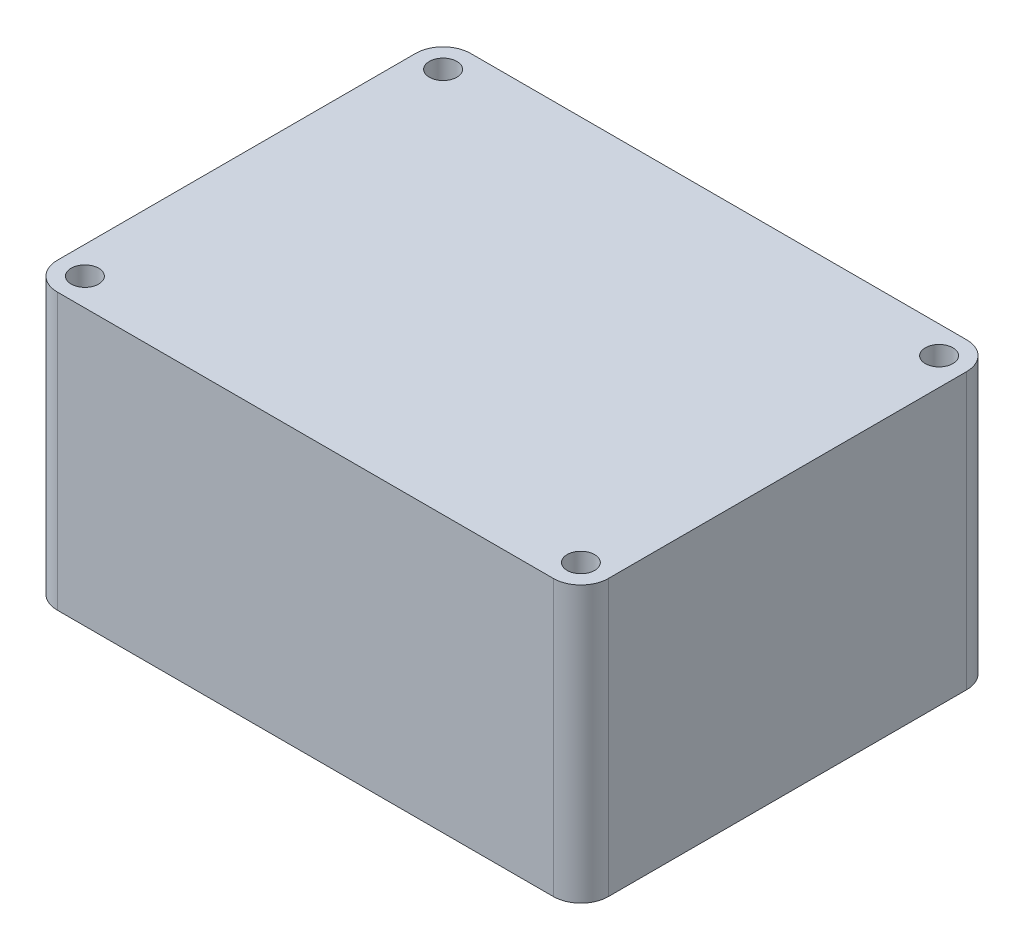
ISO-10303-21;
HEADER;
FILE_DESCRIPTION(('STEP AP214'),'2;1');
FILE_NAME('part.step','',(''),(''),'','','');
FILE_SCHEMA(('AUTOMOTIVE_DESIGN { 1 0 10303 214 1 1 1 1 }'));
ENDSEC;
DATA;
#1=APPLICATION_CONTEXT('core data for automotive mechanical design processes');
#2=APPLICATION_PROTOCOL_DEFINITION('international standard','automotive_design',2000,#1);
#3=PRODUCT_CONTEXT('',#1,'mechanical');
#4=PRODUCT('Part','Part','',(#3));
#5=PRODUCT_RELATED_PRODUCT_CATEGORY('part','',(#4));
#6=PRODUCT_DEFINITION_FORMATION('','',#4);
#7=PRODUCT_DEFINITION_CONTEXT('part definition',#1,'design');
#8=PRODUCT_DEFINITION('design','',#6,#7);
#9=PRODUCT_DEFINITION_SHAPE('','',#8);
#10=(LENGTH_UNIT() NAMED_UNIT(*) SI_UNIT(.MILLI.,.METRE.));
#11=(NAMED_UNIT(*) PLANE_ANGLE_UNIT() SI_UNIT($,.RADIAN.));
#12=(NAMED_UNIT(*) SI_UNIT($,.STERADIAN.) SOLID_ANGLE_UNIT());
#13=UNCERTAINTY_MEASURE_WITH_UNIT(LENGTH_MEASURE(1.E-05),#10,'distance_accuracy_value','');
#14=(GEOMETRIC_REPRESENTATION_CONTEXT(3) GLOBAL_UNCERTAINTY_ASSIGNED_CONTEXT((#13)) GLOBAL_UNIT_ASSIGNED_CONTEXT((#10,
#11,#12)) REPRESENTATION_CONTEXT('',''));
#15=CARTESIAN_POINT('',(0.,0.,0.));
#16=DIRECTION('',(0.,0.,1.));
#17=DIRECTION('',(1.,0.,0.));
#18=AXIS2_PLACEMENT_3D('',#15,#16,#17);
#19=CARTESIAN_POINT('',(-100.,100.,-75.));
#20=DIRECTION('',(1.,0.,0.));
#21=DIRECTION('',(0.,0.,-1.));
#22=AXIS2_PLACEMENT_3D('',#19,#20,#21);
#23=PLANE('',#22);
#24=DIRECTION('',(0.,0.,1.));
#25=VECTOR('',#24,1.);
#26=CARTESIAN_POINT('',(-100.,100.,-75.));
#27=LINE('',#26,#25);
#28=CARTESIAN_POINT('',(-100.,100.,-65.));
#29=VERTEX_POINT('',#28);
#30=CARTESIAN_POINT('',(-100.,100.,65.));
#31=VERTEX_POINT('',#30);
#32=EDGE_CURVE('E124',#29,#31,#27,.T.);
#33=ORIENTED_EDGE('',*,*,#32,.F.);
#34=DIRECTION('',(0.,-1.,0.));
#35=VECTOR('',#34,1.);
#36=CARTESIAN_POINT('',(-100.,100.,-65.));
#37=LINE('',#36,#35);
#38=CARTESIAN_POINT('',(-100.,0.,-65.));
#39=VERTEX_POINT('',#38);
#40=EDGE_CURVE('E109',#29,#39,#37,.T.);
#41=ORIENTED_EDGE('',*,*,#40,.T.);
#42=DIRECTION('',(0.,0.,1.));
#43=VECTOR('',#42,1.);
#44=CARTESIAN_POINT('',(-100.,0.,-75.));
#45=LINE('',#44,#43);
#46=CARTESIAN_POINT('',(-100.,0.,65.));
#47=VERTEX_POINT('',#46);
#48=EDGE_CURVE('E121',#39,#47,#45,.T.);
#49=ORIENTED_EDGE('',*,*,#48,.T.);
#50=DIRECTION('',(0.,-1.,0.));
#51=VECTOR('',#50,1.);
#52=CARTESIAN_POINT('',(-100.,100.,65.));
#53=LINE('',#52,#51);
#54=EDGE_CURVE('E126',#47,#31,#53,.F.);
#55=ORIENTED_EDGE('',*,*,#54,.T.);
#56=EDGE_LOOP('',(#33,#41,#49,#55));
#57=FACE_BOUND('',#56,.T.);
#58=ADVANCED_FACE('F39',(#57),#23,.F.);
#59=CARTESIAN_POINT('',(-100.,100.,75.));
#60=DIRECTION('',(0.,0.,-1.));
#61=DIRECTION('',(-1.,0.,0.));
#62=AXIS2_PLACEMENT_3D('',#59,#60,#61);
#63=PLANE('',#62);
#64=DIRECTION('',(1.,0.,0.));
#65=VECTOR('',#64,1.);
#66=CARTESIAN_POINT('',(-100.,0.,75.));
#67=LINE('',#66,#65);
#68=CARTESIAN_POINT('',(-90.,0.,75.));
#69=VERTEX_POINT('',#68);
#70=CARTESIAN_POINT('',(90.,0.,75.));
#71=VERTEX_POINT('',#70);
#72=EDGE_CURVE('E130',#69,#71,#67,.T.);
#73=ORIENTED_EDGE('',*,*,#72,.T.);
#74=DIRECTION('',(0.,-1.,0.));
#75=VECTOR('',#74,1.);
#76=CARTESIAN_POINT('',(90.,100.,75.));
#77=LINE('',#76,#75);
#78=CARTESIAN_POINT('',(90.,100.,75.));
#79=VERTEX_POINT('',#78);
#80=EDGE_CURVE('E11',#71,#79,#77,.F.);
#81=ORIENTED_EDGE('',*,*,#80,.T.);
#82=DIRECTION('',(1.,0.,0.));
#83=VECTOR('',#82,1.);
#84=CARTESIAN_POINT('',(-100.,100.,75.));
#85=LINE('',#84,#83);
#86=CARTESIAN_POINT('',(-90.,100.,75.));
#87=VERTEX_POINT('',#86);
#88=EDGE_CURVE('E170',#87,#79,#85,.T.);
#89=ORIENTED_EDGE('',*,*,#88,.F.);
#90=DIRECTION('',(0.,-1.,0.));
#91=VECTOR('',#90,1.);
#92=CARTESIAN_POINT('',(-90.,100.,75.));
#93=LINE('',#92,#91);
#94=EDGE_CURVE('E47',#87,#69,#93,.T.);
#95=ORIENTED_EDGE('',*,*,#94,.T.);
#96=EDGE_LOOP('',(#73,#81,#89,#95));
#97=FACE_BOUND('',#96,.T.);
#98=ADVANCED_FACE('F168',(#97),#63,.F.);
#99=CARTESIAN_POINT('',(100.,100.,-75.));
#100=DIRECTION('',(-1.,0.,0.));
#101=DIRECTION('',(0.,0.,1.));
#102=AXIS2_PLACEMENT_3D('',#99,#100,#101);
#103=PLANE('',#102);
#104=DIRECTION('',(0.,0.,-1.));
#105=VECTOR('',#104,1.);
#106=CARTESIAN_POINT('',(100.,0.,-75.));
#107=LINE('',#106,#105);
#108=CARTESIAN_POINT('',(100.,0.,65.));
#109=VERTEX_POINT('',#108);
#110=CARTESIAN_POINT('',(100.,0.,-65.));
#111=VERTEX_POINT('',#110);
#112=EDGE_CURVE('E134',#109,#111,#107,.T.);
#113=ORIENTED_EDGE('',*,*,#112,.T.);
#114=DIRECTION('',(0.,-1.,0.));
#115=VECTOR('',#114,1.);
#116=CARTESIAN_POINT('',(100.,100.,-65.));
#117=LINE('',#116,#115);
#118=CARTESIAN_POINT('',(100.,100.,-65.));
#119=VERTEX_POINT('',#118);
#120=EDGE_CURVE('E54',#111,#119,#117,.F.);
#121=ORIENTED_EDGE('',*,*,#120,.T.);
#122=DIRECTION('',(0.,0.,-1.));
#123=VECTOR('',#122,1.);
#124=CARTESIAN_POINT('',(100.,100.,-75.));
#125=LINE('',#124,#123);
#126=CARTESIAN_POINT('',(100.,100.,65.));
#127=VERTEX_POINT('',#126);
#128=EDGE_CURVE('E178',#127,#119,#125,.T.);
#129=ORIENTED_EDGE('',*,*,#128,.F.);
#130=DIRECTION('',(0.,-1.,0.));
#131=VECTOR('',#130,1.);
#132=CARTESIAN_POINT('',(100.,100.,65.));
#133=LINE('',#132,#131);
#134=EDGE_CURVE('E161',#127,#109,#133,.T.);
#135=ORIENTED_EDGE('',*,*,#134,.T.);
#136=EDGE_LOOP('',(#113,#121,#129,#135));
#137=FACE_BOUND('',#136,.T.);
#138=ADVANCED_FACE('F177',(#137),#103,.F.);
#139=CARTESIAN_POINT('',(-100.,100.,-75.));
#140=DIRECTION('',(0.,0.,1.));
#141=DIRECTION('',(1.,0.,0.));
#142=AXIS2_PLACEMENT_3D('',#139,#140,#141);
#143=PLANE('',#142);
#144=DIRECTION('',(-1.,0.,0.));
#145=VECTOR('',#144,1.);
#146=CARTESIAN_POINT('',(-100.,0.,-75.));
#147=LINE('',#146,#145);
#148=CARTESIAN_POINT('',(90.,0.,-75.));
#149=VERTEX_POINT('',#148);
#150=CARTESIAN_POINT('',(-90.,0.,-75.));
#151=VERTEX_POINT('',#150);
#152=EDGE_CURVE('E144',#149,#151,#147,.T.);
#153=ORIENTED_EDGE('',*,*,#152,.T.);
#154=DIRECTION('',(0.,-1.,0.));
#155=VECTOR('',#154,1.);
#156=CARTESIAN_POINT('',(-90.,100.,-75.));
#157=LINE('',#156,#155);
#158=CARTESIAN_POINT('',(-90.,100.,-75.));
#159=VERTEX_POINT('',#158);
#160=EDGE_CURVE('E110',#151,#159,#157,.F.);
#161=ORIENTED_EDGE('',*,*,#160,.T.);
#162=DIRECTION('',(-1.,0.,0.));
#163=VECTOR('',#162,1.);
#164=CARTESIAN_POINT('',(-100.,100.,-75.));
#165=LINE('',#164,#163);
#166=CARTESIAN_POINT('',(90.,100.,-75.));
#167=VERTEX_POINT('',#166);
#168=EDGE_CURVE('E140',#167,#159,#165,.T.);
#169=ORIENTED_EDGE('',*,*,#168,.F.);
#170=DIRECTION('',(0.,-1.,0.));
#171=VECTOR('',#170,1.);
#172=CARTESIAN_POINT('',(90.,100.,-75.));
#173=LINE('',#172,#171);
#174=EDGE_CURVE('E115',#167,#149,#173,.T.);
#175=ORIENTED_EDGE('',*,*,#174,.T.);
#176=EDGE_LOOP('',(#153,#161,#169,#175));
#177=FACE_BOUND('',#176,.T.);
#178=ADVANCED_FACE('F217',(#177),#143,.F.);
#179=CARTESIAN_POINT('',(0.,100.,0.));
#180=DIRECTION('',(0.,1.,0.));
#181=DIRECTION('',(0.,0.,1.));
#182=AXIS2_PLACEMENT_3D('',#179,#180,#181);
#183=PLANE('',#182);
#184=CARTESIAN_POINT('',(90.,100.,65.));
#185=DIRECTION('',(0.,1.,0.));
#186=DIRECTION('',(0.,0.,-1.));
#187=AXIS2_PLACEMENT_3D('',#184,#185,#186);
#188=CIRCLE('',#187,4.99999999999999);
#189=CARTESIAN_POINT('',(90.,100.,60.));
#190=VERTEX_POINT('',#189);
#191=EDGE_CURVE('E199',#190,#190,#188,.T.);
#192=ORIENTED_EDGE('',*,*,#191,.F.);
#193=EDGE_LOOP('',(#192));
#194=FACE_BOUND('',#193,.T.);
#195=CARTESIAN_POINT('',(-90.,100.,65.));
#196=DIRECTION('',(0.,-1.,0.));
#197=DIRECTION('',(0.,0.,-1.));
#198=AXIS2_PLACEMENT_3D('',#195,#196,#197);
#199=CIRCLE('',#198,4.99999999999999);
#200=CARTESIAN_POINT('',(-90.,100.,60.));
#201=VERTEX_POINT('',#200);
#202=EDGE_CURVE('E193',#201,#201,#199,.T.);
#203=ORIENTED_EDGE('',*,*,#202,.T.);
#204=EDGE_LOOP('',(#203));
#205=FACE_BOUND('',#204,.T.);
#206=CARTESIAN_POINT('',(90.,100.,-65.));
#207=DIRECTION('',(0.,-1.,0.));
#208=DIRECTION('',(0.,0.,1.));
#209=AXIS2_PLACEMENT_3D('',#206,#207,#208);
#210=CIRCLE('',#209,4.99999999999999);
#211=CARTESIAN_POINT('',(90.,100.,-60.));
#212=VERTEX_POINT('',#211);
#213=EDGE_CURVE('E187',#212,#212,#210,.T.);
#214=ORIENTED_EDGE('',*,*,#213,.T.);
#215=EDGE_LOOP('',(#214));
#216=FACE_BOUND('',#215,.T.);
#217=CARTESIAN_POINT('',(-90.,100.,-65.));
#218=DIRECTION('',(0.,1.,0.));
#219=DIRECTION('',(0.,0.,1.));
#220=AXIS2_PLACEMENT_3D('',#217,#218,#219);
#221=CIRCLE('',#220,4.99999999999999);
#222=CARTESIAN_POINT('',(-90.,100.,-60.));
#223=VERTEX_POINT('',#222);
#224=EDGE_CURVE('E137',#223,#223,#221,.T.);
#225=ORIENTED_EDGE('',*,*,#224,.F.);
#226=EDGE_LOOP('',(#225));
#227=FACE_BOUND('',#226,.T.);
#228=ORIENTED_EDGE('',*,*,#168,.T.);
#229=CARTESIAN_POINT('',(-90.,100.,-65.));
#230=DIRECTION('',(0.,1.,0.));
#231=DIRECTION('',(0.,0.,1.));
#232=AXIS2_PLACEMENT_3D('',#229,#230,#231);
#233=CIRCLE('',#232,10.);
#234=EDGE_CURVE('E159',#159,#29,#233,.T.);
#235=ORIENTED_EDGE('',*,*,#234,.T.);
#236=ORIENTED_EDGE('',*,*,#32,.T.);
#237=CARTESIAN_POINT('',(-90.,100.,65.));
#238=DIRECTION('',(0.,1.,0.));
#239=DIRECTION('',(0.,0.,1.));
#240=AXIS2_PLACEMENT_3D('',#237,#238,#239);
#241=CIRCLE('',#240,10.);
#242=EDGE_CURVE('E154',#31,#87,#241,.T.);
#243=ORIENTED_EDGE('',*,*,#242,.T.);
#244=ORIENTED_EDGE('',*,*,#88,.T.);
#245=CARTESIAN_POINT('',(90.,100.,65.));
#246=DIRECTION('',(0.,1.,0.));
#247=DIRECTION('',(0.,0.,1.));
#248=AXIS2_PLACEMENT_3D('',#245,#246,#247);
#249=CIRCLE('',#248,10.);
#250=EDGE_CURVE('E61',#79,#127,#249,.T.);
#251=ORIENTED_EDGE('',*,*,#250,.T.);
#252=ORIENTED_EDGE('',*,*,#128,.T.);
#253=CARTESIAN_POINT('',(90.,100.,-65.));
#254=DIRECTION('',(0.,1.,0.));
#255=DIRECTION('',(0.,0.,1.));
#256=AXIS2_PLACEMENT_3D('',#253,#254,#255);
#257=CIRCLE('',#256,10.);
#258=EDGE_CURVE('E157',#119,#167,#257,.T.);
#259=ORIENTED_EDGE('',*,*,#258,.T.);
#260=EDGE_LOOP('',(#228,#235,#236,#243,#244,#251,#252,#259));
#261=FACE_BOUND('',#260,.T.);
#262=ADVANCED_FACE('F214',(#194,#205,#216,#227,#261),#183,.T.);
#263=CARTESIAN_POINT('',(0.,0.,0.));
#264=DIRECTION('',(0.,1.,0.));
#265=DIRECTION('',(0.,0.,1.));
#266=AXIS2_PLACEMENT_3D('',#263,#264,#265);
#267=PLANE('',#266);
#268=CARTESIAN_POINT('',(90.,0.,65.));
#269=DIRECTION('',(0.,1.,0.));
#270=DIRECTION('',(0.,0.,-1.));
#271=AXIS2_PLACEMENT_3D('',#268,#269,#270);
#272=CIRCLE('',#271,4.99999999999999);
#273=CARTESIAN_POINT('',(90.,0.,60.));
#274=VERTEX_POINT('',#273);
#275=EDGE_CURVE('E196',#274,#274,#272,.T.);
#276=ORIENTED_EDGE('',*,*,#275,.T.);
#277=EDGE_LOOP('',(#276));
#278=FACE_BOUND('',#277,.T.);
#279=CARTESIAN_POINT('',(-90.,0.,65.));
#280=DIRECTION('',(0.,-1.,0.));
#281=DIRECTION('',(0.,0.,-1.));
#282=AXIS2_PLACEMENT_3D('',#279,#280,#281);
#283=CIRCLE('',#282,4.99999999999999);
#284=CARTESIAN_POINT('',(-90.,0.,60.));
#285=VERTEX_POINT('',#284);
#286=EDGE_CURVE('E190',#285,#285,#283,.T.);
#287=ORIENTED_EDGE('',*,*,#286,.F.);
#288=EDGE_LOOP('',(#287));
#289=FACE_BOUND('',#288,.T.);
#290=CARTESIAN_POINT('',(90.,0.,-65.));
#291=DIRECTION('',(0.,-1.,0.));
#292=DIRECTION('',(0.,0.,1.));
#293=AXIS2_PLACEMENT_3D('',#290,#291,#292);
#294=CIRCLE('',#293,4.99999999999999);
#295=CARTESIAN_POINT('',(90.,0.,-60.));
#296=VERTEX_POINT('',#295);
#297=EDGE_CURVE('E185',#296,#296,#294,.T.);
#298=ORIENTED_EDGE('',*,*,#297,.F.);
#299=EDGE_LOOP('',(#298));
#300=FACE_BOUND('',#299,.T.);
#301=CARTESIAN_POINT('',(-90.,0.,-65.));
#302=DIRECTION('',(0.,1.,0.));
#303=DIRECTION('',(0.,0.,1.));
#304=AXIS2_PLACEMENT_3D('',#301,#302,#303);
#305=CIRCLE('',#304,4.99999999999999);
#306=CARTESIAN_POINT('',(-90.,0.,-60.));
#307=VERTEX_POINT('',#306);
#308=EDGE_CURVE('E131',#307,#307,#305,.T.);
#309=ORIENTED_EDGE('',*,*,#308,.T.);
#310=EDGE_LOOP('',(#309));
#311=FACE_BOUND('',#310,.T.);
#312=ORIENTED_EDGE('',*,*,#48,.F.);
#313=CARTESIAN_POINT('',(-90.,0.,-65.));
#314=DIRECTION('',(0.,1.,0.));
#315=DIRECTION('',(0.,0.,1.));
#316=AXIS2_PLACEMENT_3D('',#313,#314,#315);
#317=CIRCLE('',#316,10.);
#318=EDGE_CURVE('E105',#39,#151,#317,.F.);
#319=ORIENTED_EDGE('',*,*,#318,.T.);
#320=ORIENTED_EDGE('',*,*,#152,.F.);
#321=CARTESIAN_POINT('',(90.,0.,-65.));
#322=DIRECTION('',(0.,1.,0.));
#323=DIRECTION('',(0.,0.,1.));
#324=AXIS2_PLACEMENT_3D('',#321,#322,#323);
#325=CIRCLE('',#324,10.);
#326=EDGE_CURVE('E116',#149,#111,#325,.F.);
#327=ORIENTED_EDGE('',*,*,#326,.T.);
#328=ORIENTED_EDGE('',*,*,#112,.F.);
#329=CARTESIAN_POINT('',(90.,0.,65.));
#330=DIRECTION('',(0.,1.,0.));
#331=DIRECTION('',(0.,0.,1.));
#332=AXIS2_PLACEMENT_3D('',#329,#330,#331);
#333=CIRCLE('',#332,10.);
#334=EDGE_CURVE('E148',#109,#71,#333,.F.);
#335=ORIENTED_EDGE('',*,*,#334,.T.);
#336=ORIENTED_EDGE('',*,*,#72,.F.);
#337=CARTESIAN_POINT('',(-90.,0.,65.));
#338=DIRECTION('',(0.,1.,0.));
#339=DIRECTION('',(0.,0.,1.));
#340=AXIS2_PLACEMENT_3D('',#337,#338,#339);
#341=CIRCLE('',#340,10.);
#342=EDGE_CURVE('E125',#69,#47,#341,.F.);
#343=ORIENTED_EDGE('',*,*,#342,.T.);
#344=EDGE_LOOP('',(#312,#319,#320,#327,#328,#335,#336,#343));
#345=FACE_BOUND('',#344,.T.);
#346=ADVANCED_FACE('F128',(#278,#289,#300,#311,#345),#267,.F.);
#347=CARTESIAN_POINT('',(-90.,100.,-65.));
#348=DIRECTION('',(0.,-1.,0.));
#349=DIRECTION('',(0.,0.,-1.));
#350=AXIS2_PLACEMENT_3D('',#347,#348,#349);
#351=CYLINDRICAL_SURFACE('',#350,10.);
#352=ORIENTED_EDGE('',*,*,#234,.F.);
#353=ORIENTED_EDGE('',*,*,#160,.F.);
#354=ORIENTED_EDGE('',*,*,#318,.F.);
#355=ORIENTED_EDGE('',*,*,#40,.F.);
#356=EDGE_LOOP('',(#352,#353,#354,#355));
#357=FACE_BOUND('',#356,.T.);
#358=ADVANCED_FACE('F108',(#357),#351,.T.);
#359=CARTESIAN_POINT('',(90.,100.,-65.));
#360=DIRECTION('',(0.,-1.,0.));
#361=DIRECTION('',(0.,0.,-1.));
#362=AXIS2_PLACEMENT_3D('',#359,#360,#361);
#363=CYLINDRICAL_SURFACE('',#362,10.);
#364=ORIENTED_EDGE('',*,*,#258,.F.);
#365=ORIENTED_EDGE('',*,*,#120,.F.);
#366=ORIENTED_EDGE('',*,*,#326,.F.);
#367=ORIENTED_EDGE('',*,*,#174,.F.);
#368=EDGE_LOOP('',(#364,#365,#366,#367));
#369=FACE_BOUND('',#368,.T.);
#370=ADVANCED_FACE('F228',(#369),#363,.T.);
#371=CARTESIAN_POINT('',(90.,100.,65.));
#372=DIRECTION('',(0.,-1.,0.));
#373=DIRECTION('',(0.,0.,-1.));
#374=AXIS2_PLACEMENT_3D('',#371,#372,#373);
#375=CYLINDRICAL_SURFACE('',#374,10.);
#376=ORIENTED_EDGE('',*,*,#250,.F.);
#377=ORIENTED_EDGE('',*,*,#80,.F.);
#378=ORIENTED_EDGE('',*,*,#334,.F.);
#379=ORIENTED_EDGE('',*,*,#134,.F.);
#380=EDGE_LOOP('',(#376,#377,#378,#379));
#381=FACE_BOUND('',#380,.T.);
#382=ADVANCED_FACE('F176',(#381),#375,.T.);
#383=CARTESIAN_POINT('',(-90.,100.,65.));
#384=DIRECTION('',(0.,-1.,0.));
#385=DIRECTION('',(0.,0.,-1.));
#386=AXIS2_PLACEMENT_3D('',#383,#384,#385);
#387=CYLINDRICAL_SURFACE('',#386,10.);
#388=ORIENTED_EDGE('',*,*,#242,.F.);
#389=ORIENTED_EDGE('',*,*,#54,.F.);
#390=ORIENTED_EDGE('',*,*,#342,.F.);
#391=ORIENTED_EDGE('',*,*,#94,.F.);
#392=EDGE_LOOP('',(#388,#389,#390,#391));
#393=FACE_BOUND('',#392,.T.);
#394=ADVANCED_FACE('F41',(#393),#387,.T.);
#395=CARTESIAN_POINT('',(-90.,0.,-65.));
#396=DIRECTION('',(0.,1.,0.));
#397=DIRECTION('',(0.,0.,1.));
#398=AXIS2_PLACEMENT_3D('',#395,#396,#397);
#399=CYLINDRICAL_SURFACE('',#398,4.99999999999999);
#400=ORIENTED_EDGE('',*,*,#308,.F.);
#401=EDGE_LOOP('',(#400));
#402=FACE_BOUND('',#401,.T.);
#403=ORIENTED_EDGE('',*,*,#224,.T.);
#404=EDGE_LOOP('',(#403));
#405=FACE_BOUND('',#404,.T.);
#406=ADVANCED_FACE('F249',(#402,#405),#399,.F.);
#407=CARTESIAN_POINT('',(90.,0.,-65.));
#408=DIRECTION('',(0.,1.,0.));
#409=DIRECTION('',(0.,0.,1.));
#410=AXIS2_PLACEMENT_3D('',#407,#408,#409);
#411=CYLINDRICAL_SURFACE('',#410,4.99999999999999);
#412=ORIENTED_EDGE('',*,*,#297,.T.);
#413=EDGE_LOOP('',(#412));
#414=FACE_BOUND('',#413,.T.);
#415=ORIENTED_EDGE('',*,*,#213,.F.);
#416=EDGE_LOOP('',(#415));
#417=FACE_BOUND('',#416,.T.);
#418=ADVANCED_FACE('F252',(#414,#417),#411,.F.);
#419=CARTESIAN_POINT('',(-90.,0.,65.));
#420=DIRECTION('',(0.,1.,0.));
#421=DIRECTION('',(0.,0.,1.));
#422=AXIS2_PLACEMENT_3D('',#419,#420,#421);
#423=CYLINDRICAL_SURFACE('',#422,4.99999999999999);
#424=ORIENTED_EDGE('',*,*,#286,.T.);
#425=EDGE_LOOP('',(#424));
#426=FACE_BOUND('',#425,.T.);
#427=ORIENTED_EDGE('',*,*,#202,.F.);
#428=EDGE_LOOP('',(#427));
#429=FACE_BOUND('',#428,.T.);
#430=ADVANCED_FACE('F210',(#426,#429),#423,.F.);
#431=CARTESIAN_POINT('',(90.,0.,65.));
#432=DIRECTION('',(0.,1.,0.));
#433=DIRECTION('',(0.,0.,1.));
#434=AXIS2_PLACEMENT_3D('',#431,#432,#433);
#435=CYLINDRICAL_SURFACE('',#434,4.99999999999999);
#436=ORIENTED_EDGE('',*,*,#275,.F.);
#437=EDGE_LOOP('',(#436));
#438=FACE_BOUND('',#437,.T.);
#439=ORIENTED_EDGE('',*,*,#191,.T.);
#440=EDGE_LOOP('',(#439));
#441=FACE_BOUND('',#440,.T.);
#442=ADVANCED_FACE('F207',(#438,#441),#435,.F.);
#443=CLOSED_SHELL('',(#58,#98,#138,#178,#262,#346,#358,#370,#382,#394,#406,#418,#430,#442));
#444=MANIFOLD_SOLID_BREP('B2',#443);
#445=ADVANCED_BREP_SHAPE_REPRESENTATION('',(#18,#444),#14);
#446=SHAPE_DEFINITION_REPRESENTATION(#9,#445);
ENDSEC;
END-ISO-10303-21;
